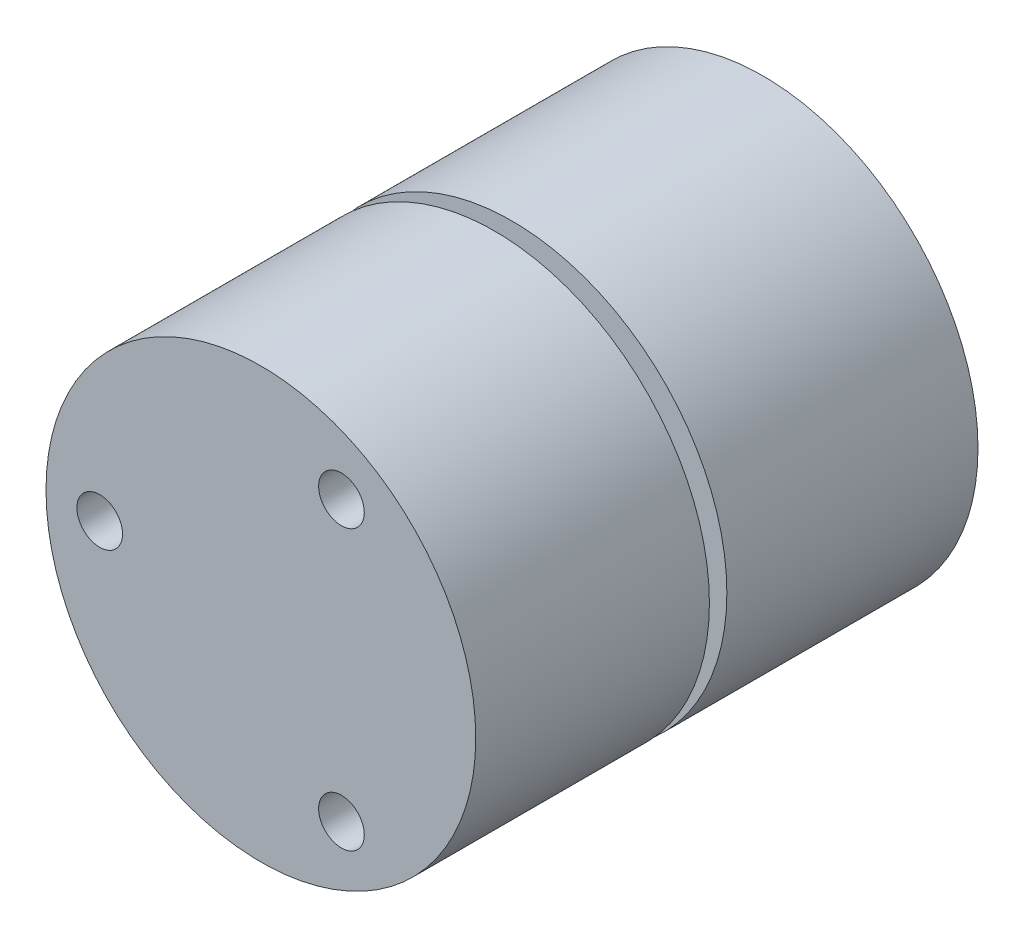
ISO-10303-21;
HEADER;
FILE_DESCRIPTION(('STEP AP214'),'2;1');
FILE_NAME('part.step','',(''),(''),'','','');
FILE_SCHEMA(('AUTOMOTIVE_DESIGN { 1 0 10303 214 1 1 1 1 }'));
ENDSEC;
DATA;
#1=APPLICATION_CONTEXT('core data for automotive mechanical design processes');
#2=APPLICATION_PROTOCOL_DEFINITION('international standard','automotive_design',2000,#1);
#3=PRODUCT_CONTEXT('',#1,'mechanical');
#4=PRODUCT('Part','Part','',(#3));
#5=PRODUCT_RELATED_PRODUCT_CATEGORY('part','',(#4));
#6=PRODUCT_DEFINITION_FORMATION('','',#4);
#7=PRODUCT_DEFINITION_CONTEXT('part definition',#1,'design');
#8=PRODUCT_DEFINITION('design','',#6,#7);
#9=PRODUCT_DEFINITION_SHAPE('','',#8);
#10=(LENGTH_UNIT() NAMED_UNIT(*) SI_UNIT(.MILLI.,.METRE.));
#11=(NAMED_UNIT(*) PLANE_ANGLE_UNIT() SI_UNIT($,.RADIAN.));
#12=(NAMED_UNIT(*) SI_UNIT($,.STERADIAN.) SOLID_ANGLE_UNIT());
#13=UNCERTAINTY_MEASURE_WITH_UNIT(LENGTH_MEASURE(1.E-05),#10,'distance_accuracy_value','');
#14=(GEOMETRIC_REPRESENTATION_CONTEXT(3) GLOBAL_UNCERTAINTY_ASSIGNED_CONTEXT((#13)) GLOBAL_UNIT_ASSIGNED_CONTEXT((#10,
#11,#12)) REPRESENTATION_CONTEXT('',''));
#15=CARTESIAN_POINT('',(0.,0.,0.));
#16=DIRECTION('',(0.,0.,1.));
#17=DIRECTION('',(1.,0.,0.));
#18=AXIS2_PLACEMENT_3D('',#15,#16,#17);
#19=CARTESIAN_POINT('',(0.,0.,18.7));
#20=DIRECTION('',(0.,0.,-1.));
#21=DIRECTION('',(-1.,0.,0.));
#22=AXIS2_PLACEMENT_3D('',#19,#20,#21);
#23=CYLINDRICAL_SURFACE('',#22,8.);
#24=CARTESIAN_POINT('',(0.,0.,11.9));
#25=DIRECTION('',(0.,0.,-1.));
#26=DIRECTION('',(-1.,0.,0.));
#27=AXIS2_PLACEMENT_3D('',#24,#25,#26);
#28=CIRCLE('',#27,8.);
#29=CARTESIAN_POINT('',(-7.41619848709566,-3.,11.9));
#30=VERTEX_POINT('',#29);
#31=CARTESIAN_POINT('',(-7.41619848709566,3.,11.9));
#32=VERTEX_POINT('',#31);
#33=EDGE_CURVE('E48',#30,#32,#28,.T.);
#34=ORIENTED_EDGE('',*,*,#33,.T.);
#35=DIRECTION('',(0.,0.,-1.));
#36=VECTOR('',#35,1.);
#37=CARTESIAN_POINT('',(-7.41619848709566,3.,18.7));
#38=LINE('',#37,#36);
#39=CARTESIAN_POINT('',(-7.41619848709566,3.,15.9));
#40=VERTEX_POINT('',#39);
#41=EDGE_CURVE('E11',#32,#40,#38,.F.);
#42=ORIENTED_EDGE('',*,*,#41,.T.);
#43=CARTESIAN_POINT('',(0.,0.,15.9));
#44=DIRECTION('',(0.,0.,1.));
#45=DIRECTION('',(1.,0.,0.));
#46=AXIS2_PLACEMENT_3D('',#43,#44,#45);
#47=CIRCLE('',#46,8.);
#48=CARTESIAN_POINT('',(-7.41619848709566,-3.,15.9));
#49=VERTEX_POINT('',#48);
#50=EDGE_CURVE('E82',#40,#49,#47,.T.);
#51=ORIENTED_EDGE('',*,*,#50,.T.);
#52=DIRECTION('',(0.,0.,-1.));
#53=VECTOR('',#52,1.);
#54=CARTESIAN_POINT('',(-7.41619848709566,-3.,18.7));
#55=LINE('',#54,#53);
#56=EDGE_CURVE('E130',#49,#30,#55,.T.);
#57=ORIENTED_EDGE('',*,*,#56,.T.);
#58=EDGE_LOOP('',(#34,#42,#51,#57));
#59=FACE_BOUND('',#58,.T.);
#60=CARTESIAN_POINT('',(0.,0.,18.7));
#61=DIRECTION('',(0.,0.,1.));
#62=DIRECTION('',(1.,0.,0.));
#63=AXIS2_PLACEMENT_3D('',#60,#61,#62);
#64=CIRCLE('',#63,8.);
#65=CARTESIAN_POINT('',(8.,0.,18.7));
#66=VERTEX_POINT('',#65);
#67=EDGE_CURVE('E121',#66,#66,#64,.T.);
#68=ORIENTED_EDGE('',*,*,#67,.F.);
#69=EDGE_LOOP('',(#68));
#70=FACE_BOUND('',#69,.T.);
#71=CARTESIAN_POINT('',(0.,0.,10.));
#72=DIRECTION('',(0.,0.,1.));
#73=DIRECTION('',(1.,0.,0.));
#74=AXIS2_PLACEMENT_3D('',#71,#72,#73);
#75=CIRCLE('',#74,8.);
#76=CARTESIAN_POINT('',(8.,0.,10.));
#77=VERTEX_POINT('',#76);
#78=EDGE_CURVE('E178',#77,#77,#75,.T.);
#79=ORIENTED_EDGE('',*,*,#78,.T.);
#80=EDGE_LOOP('',(#79));
#81=FACE_BOUND('',#80,.T.);
#82=ADVANCED_FACE('F39',(#59,#70,#81),#23,.T.);
#83=CARTESIAN_POINT('',(0.,0.,18.7));
#84=DIRECTION('',(0.,0.,1.));
#85=DIRECTION('',(1.,0.,0.));
#86=AXIS2_PLACEMENT_3D('',#83,#84,#85);
#87=PLANE('',#86);
#88=CARTESIAN_POINT('',(2.99999999999998,-5.19615242270664,18.7));
#89=DIRECTION('',(0.,0.,1.));
#90=DIRECTION('',(1.,0.,0.));
#91=AXIS2_PLACEMENT_3D('',#88,#89,#90);
#92=CIRCLE('',#91,0.85);
#93=CARTESIAN_POINT('',(3.84999999999998,-5.19615242270664,18.7));
#94=VERTEX_POINT('',#93);
#95=EDGE_CURVE('E227',#94,#94,#92,.T.);
#96=ORIENTED_EDGE('',*,*,#95,.F.);
#97=EDGE_LOOP('',(#96));
#98=FACE_BOUND('',#97,.T.);
#99=CARTESIAN_POINT('',(2.99999999999999,5.19615242270664,18.7));
#100=DIRECTION('',(0.,0.,1.));
#101=DIRECTION('',(1.,0.,0.));
#102=AXIS2_PLACEMENT_3D('',#99,#100,#101);
#103=CIRCLE('',#102,0.85);
#104=CARTESIAN_POINT('',(3.84999999999999,5.19615242270664,18.7));
#105=VERTEX_POINT('',#104);
#106=EDGE_CURVE('E212',#105,#105,#103,.T.);
#107=ORIENTED_EDGE('',*,*,#106,.F.);
#108=EDGE_LOOP('',(#107));
#109=FACE_BOUND('',#108,.T.);
#110=CARTESIAN_POINT('',(-6.,0.,18.7));
#111=DIRECTION('',(0.,0.,1.));
#112=DIRECTION('',(1.,0.,0.));
#113=AXIS2_PLACEMENT_3D('',#110,#111,#112);
#114=CIRCLE('',#113,0.85);
#115=CARTESIAN_POINT('',(-5.15,0.,18.7));
#116=VERTEX_POINT('',#115);
#117=EDGE_CURVE('E207',#116,#116,#114,.T.);
#118=ORIENTED_EDGE('',*,*,#117,.F.);
#119=EDGE_LOOP('',(#118));
#120=FACE_BOUND('',#119,.T.);
#121=ORIENTED_EDGE('',*,*,#67,.T.);
#122=EDGE_LOOP('',(#121));
#123=FACE_BOUND('',#122,.T.);
#124=ADVANCED_FACE('F151',(#98,#109,#120,#123),#87,.T.);
#125=CARTESIAN_POINT('',(-18.7,3.,11.9));
#126=DIRECTION('',(0.,1.,0.));
#127=DIRECTION('',(0.,0.,1.));
#128=AXIS2_PLACEMENT_3D('',#125,#126,#127);
#129=PLANE('',#128);
#130=DIRECTION('',(1.,0.,0.));
#131=VECTOR('',#130,1.);
#132=CARTESIAN_POINT('',(-18.7,3.,11.9));
#133=LINE('',#132,#131);
#134=CARTESIAN_POINT('',(0.,3.,11.9));
#135=VERTEX_POINT('',#134);
#136=EDGE_CURVE('E99',#32,#135,#133,.T.);
#137=ORIENTED_EDGE('',*,*,#136,.T.);
#138=DIRECTION('',(0.,0.,1.));
#139=VECTOR('',#138,1.);
#140=CARTESIAN_POINT('',(0.,3.,11.9));
#141=LINE('',#140,#139);
#142=CARTESIAN_POINT('',(0.,3.,15.9));
#143=VERTEX_POINT('',#142);
#144=EDGE_CURVE('E92',#135,#143,#141,.T.);
#145=ORIENTED_EDGE('',*,*,#144,.T.);
#146=DIRECTION('',(1.,0.,0.));
#147=VECTOR('',#146,1.);
#148=CARTESIAN_POINT('',(-18.7,3.,15.9));
#149=LINE('',#148,#147);
#150=EDGE_CURVE('E77',#40,#143,#149,.T.);
#151=ORIENTED_EDGE('',*,*,#150,.F.);
#152=ORIENTED_EDGE('',*,*,#41,.F.);
#153=EDGE_LOOP('',(#137,#145,#151,#152));
#154=FACE_BOUND('',#153,.T.);
#155=ADVANCED_FACE('F98',(#154),#129,.F.);
#156=CARTESIAN_POINT('',(-18.7,-3.,11.9));
#157=DIRECTION('',(0.,0.,-1.));
#158=DIRECTION('',(-1.,0.,0.));
#159=AXIS2_PLACEMENT_3D('',#156,#157,#158);
#160=PLANE('',#159);
#161=DIRECTION('',(1.,0.,0.));
#162=VECTOR('',#161,1.);
#163=CARTESIAN_POINT('',(-18.7,-3.,11.9));
#164=LINE('',#163,#162);
#165=CARTESIAN_POINT('',(0.,-3.,11.9));
#166=VERTEX_POINT('',#165);
#167=EDGE_CURVE('E116',#30,#166,#164,.T.);
#168=ORIENTED_EDGE('',*,*,#167,.T.);
#169=DIRECTION('',(0.,1.,0.));
#170=VECTOR('',#169,1.);
#171=CARTESIAN_POINT('',(0.,-3.,11.9));
#172=LINE('',#171,#170);
#173=EDGE_CURVE('E85',#166,#135,#172,.T.);
#174=ORIENTED_EDGE('',*,*,#173,.T.);
#175=ORIENTED_EDGE('',*,*,#136,.F.);
#176=ORIENTED_EDGE('',*,*,#33,.F.);
#177=EDGE_LOOP('',(#168,#174,#175,#176));
#178=FACE_BOUND('',#177,.T.);
#179=ADVANCED_FACE('F139',(#178),#160,.F.);
#180=CARTESIAN_POINT('',(-18.7,-3.,15.9));
#181=DIRECTION('',(0.,-1.,0.));
#182=DIRECTION('',(0.,0.,-1.));
#183=AXIS2_PLACEMENT_3D('',#180,#181,#182);
#184=PLANE('',#183);
#185=DIRECTION('',(1.,0.,0.));
#186=VECTOR('',#185,1.);
#187=CARTESIAN_POINT('',(-18.7,-3.,15.9));
#188=LINE('',#187,#186);
#189=CARTESIAN_POINT('',(0.,-3.,15.9));
#190=VERTEX_POINT('',#189);
#191=EDGE_CURVE('E55',#49,#190,#188,.T.);
#192=ORIENTED_EDGE('',*,*,#191,.T.);
#193=DIRECTION('',(0.,0.,-1.));
#194=VECTOR('',#193,1.);
#195=CARTESIAN_POINT('',(0.,-3.,15.9));
#196=LINE('',#195,#194);
#197=EDGE_CURVE('E95',#190,#166,#196,.T.);
#198=ORIENTED_EDGE('',*,*,#197,.T.);
#199=ORIENTED_EDGE('',*,*,#167,.F.);
#200=ORIENTED_EDGE('',*,*,#56,.F.);
#201=EDGE_LOOP('',(#192,#198,#199,#200));
#202=FACE_BOUND('',#201,.T.);
#203=ADVANCED_FACE('F141',(#202),#184,.F.);
#204=CARTESIAN_POINT('',(-18.7,3.,15.9));
#205=DIRECTION('',(0.,0.,1.));
#206=DIRECTION('',(1.,0.,0.));
#207=AXIS2_PLACEMENT_3D('',#204,#205,#206);
#208=PLANE('',#207);
#209=ORIENTED_EDGE('',*,*,#150,.T.);
#210=DIRECTION('',(0.,-1.,0.));
#211=VECTOR('',#210,1.);
#212=CARTESIAN_POINT('',(0.,3.,15.9));
#213=LINE('',#212,#211);
#214=EDGE_CURVE('E80',#143,#190,#213,.T.);
#215=ORIENTED_EDGE('',*,*,#214,.T.);
#216=ORIENTED_EDGE('',*,*,#191,.F.);
#217=ORIENTED_EDGE('',*,*,#50,.F.);
#218=EDGE_LOOP('',(#209,#215,#216,#217));
#219=FACE_BOUND('',#218,.T.);
#220=ADVANCED_FACE('F79',(#219),#208,.F.);
#221=CARTESIAN_POINT('',(0.,0.,0.));
#222=DIRECTION('',(1.,0.,0.));
#223=DIRECTION('',(0.,0.,-1.));
#224=AXIS2_PLACEMENT_3D('',#221,#222,#223);
#225=PLANE('',#224);
#226=ORIENTED_EDGE('',*,*,#144,.F.);
#227=ORIENTED_EDGE('',*,*,#173,.F.);
#228=ORIENTED_EDGE('',*,*,#197,.F.);
#229=ORIENTED_EDGE('',*,*,#214,.F.);
#230=EDGE_LOOP('',(#226,#227,#228,#229));
#231=FACE_BOUND('',#230,.T.);
#232=ADVANCED_FACE('F90',(#231),#225,.F.);
#233=CARTESIAN_POINT('',(0.,8.,10.));
#234=DIRECTION('',(0.,0.,-1.));
#235=DIRECTION('',(-1.,0.,0.));
#236=AXIS2_PLACEMENT_3D('',#233,#234,#235);
#237=PLANE('',#236);
#238=CARTESIAN_POINT('',(0.,0.,10.));
#239=DIRECTION('',(0.,0.,1.));
#240=DIRECTION('',(1.,0.,0.));
#241=AXIS2_PLACEMENT_3D('',#238,#239,#240);
#242=CIRCLE('',#241,4.71457689328128);
#243=CARTESIAN_POINT('',(4.71457689328128,0.,10.));
#244=VERTEX_POINT('',#243);
#245=EDGE_CURVE('E101',#244,#244,#242,.T.);
#246=ORIENTED_EDGE('',*,*,#245,.T.);
#247=EDGE_LOOP('',(#246));
#248=FACE_BOUND('',#247,.T.);
#249=ORIENTED_EDGE('',*,*,#78,.F.);
#250=EDGE_LOOP('',(#249));
#251=FACE_BOUND('',#250,.T.);
#252=ADVANCED_FACE('F252',(#248,#251),#237,.T.);
#253=CARTESIAN_POINT('',(0.,0.,18.7));
#254=DIRECTION('',(0.,0.,1.));
#255=DIRECTION('',(1.,0.,0.));
#256=AXIS2_PLACEMENT_3D('',#253,#254,#255);
#257=CYLINDRICAL_SURFACE('',#256,4.71457689328128);
#258=ORIENTED_EDGE('',*,*,#245,.F.);
#259=EDGE_LOOP('',(#258));
#260=FACE_BOUND('',#259,.T.);
#261=CARTESIAN_POINT('',(0.,0.,9.35));
#262=DIRECTION('',(0.,0.,1.));
#263=DIRECTION('',(1.,0.,0.));
#264=AXIS2_PLACEMENT_3D('',#261,#262,#263);
#265=CIRCLE('',#264,4.71457689328128);
#266=CARTESIAN_POINT('',(4.71457689328128,0.,9.35));
#267=VERTEX_POINT('',#266);
#268=EDGE_CURVE('E105',#267,#267,#265,.T.);
#269=ORIENTED_EDGE('',*,*,#268,.T.);
#270=EDGE_LOOP('',(#269));
#271=FACE_BOUND('',#270,.T.);
#272=ADVANCED_FACE('F254',(#260,#271),#257,.T.);
#273=CARTESIAN_POINT('',(0.,8.,9.35));
#274=DIRECTION('',(0.,0.,-1.));
#275=DIRECTION('',(-1.,0.,0.));
#276=AXIS2_PLACEMENT_3D('',#273,#274,#275);
#277=PLANE('',#276);
#278=ORIENTED_EDGE('',*,*,#268,.F.);
#279=EDGE_LOOP('',(#278));
#280=FACE_BOUND('',#279,.T.);
#281=CARTESIAN_POINT('',(0.,0.,9.35));
#282=DIRECTION('',(0.,0.,1.));
#283=DIRECTION('',(1.,0.,0.));
#284=AXIS2_PLACEMENT_3D('',#281,#282,#283);
#285=CIRCLE('',#284,8.);
#286=CARTESIAN_POINT('',(8.,0.,9.35));
#287=VERTEX_POINT('',#286);
#288=EDGE_CURVE('E173',#287,#287,#285,.T.);
#289=ORIENTED_EDGE('',*,*,#288,.T.);
#290=EDGE_LOOP('',(#289));
#291=FACE_BOUND('',#290,.T.);
#292=ADVANCED_FACE('F168',(#280,#291),#277,.F.);
#293=CARTESIAN_POINT('',(0.,0.,0.));
#294=DIRECTION('',(0.,0.,1.));
#295=DIRECTION('',(1.,0.,0.));
#296=AXIS2_PLACEMENT_3D('',#293,#294,#295);
#297=PLANE('',#296);
#298=CARTESIAN_POINT('',(2.99999999999998,-5.19615242270664,0.));
#299=DIRECTION('',(0.,0.,-1.));
#300=DIRECTION('',(-1.,0.,0.));
#301=AXIS2_PLACEMENT_3D('',#298,#299,#300);
#302=CIRCLE('',#301,0.85);
#303=CARTESIAN_POINT('',(2.14999999999998,-5.19615242270664,0.));
#304=VERTEX_POINT('',#303);
#305=EDGE_CURVE('E219',#304,#304,#302,.T.);
#306=ORIENTED_EDGE('',*,*,#305,.F.);
#307=EDGE_LOOP('',(#306));
#308=FACE_BOUND('',#307,.T.);
#309=CARTESIAN_POINT('',(-6.,0.,0.));
#310=DIRECTION('',(0.,0.,1.));
#311=DIRECTION('',(1.,0.,0.));
#312=AXIS2_PLACEMENT_3D('',#309,#310,#311);
#313=CIRCLE('',#312,0.85);
#314=CARTESIAN_POINT('',(-5.15,0.,0.));
#315=VERTEX_POINT('',#314);
#316=EDGE_CURVE('E196',#315,#315,#313,.T.);
#317=ORIENTED_EDGE('',*,*,#316,.T.);
#318=EDGE_LOOP('',(#317));
#319=FACE_BOUND('',#318,.T.);
#320=CARTESIAN_POINT('',(2.99999999999999,5.19615242270664,0.));
#321=DIRECTION('',(0.,0.,1.));
#322=DIRECTION('',(1.,0.,0.));
#323=AXIS2_PLACEMENT_3D('',#320,#321,#322);
#324=CIRCLE('',#323,0.85);
#325=CARTESIAN_POINT('',(3.84999999999999,5.19615242270664,0.));
#326=VERTEX_POINT('',#325);
#327=EDGE_CURVE('E191',#326,#326,#324,.T.);
#328=ORIENTED_EDGE('',*,*,#327,.T.);
#329=EDGE_LOOP('',(#328));
#330=FACE_BOUND('',#329,.T.);
#331=CARTESIAN_POINT('',(0.,0.,0.));
#332=DIRECTION('',(0.,0.,1.));
#333=DIRECTION('',(1.,0.,0.));
#334=AXIS2_PLACEMENT_3D('',#331,#332,#333);
#335=CIRCLE('',#334,8.);
#336=CARTESIAN_POINT('',(8.,0.,0.));
#337=VERTEX_POINT('',#336);
#338=EDGE_CURVE('E115',#337,#337,#335,.T.);
#339=ORIENTED_EDGE('',*,*,#338,.F.);
#340=EDGE_LOOP('',(#339));
#341=FACE_BOUND('',#340,.T.);
#342=ADVANCED_FACE('F159',(#308,#319,#330,#341),#297,.F.);
#343=ORIENTED_EDGE('',*,*,#288,.F.);
#344=EDGE_LOOP('',(#343));
#345=FACE_BOUND('',#344,.T.);
#346=ORIENTED_EDGE('',*,*,#338,.T.);
#347=EDGE_LOOP('',(#346));
#348=FACE_BOUND('',#347,.T.);
#349=ADVANCED_FACE('F41',(#345,#348),#23,.T.);
#350=CARTESIAN_POINT('',(2.99999999999999,5.19615242270664,2.));
#351=DIRECTION('',(0.,0.,-1.));
#352=DIRECTION('',(-1.,0.,0.));
#353=AXIS2_PLACEMENT_3D('',#350,#351,#352);
#354=CYLINDRICAL_SURFACE('',#353,0.85);
#355=CARTESIAN_POINT('',(2.99999999999999,5.19615242270664,2.));
#356=DIRECTION('',(0.,0.,1.));
#357=DIRECTION('',(1.,0.,0.));
#358=AXIS2_PLACEMENT_3D('',#355,#356,#357);
#359=CIRCLE('',#358,0.85);
#360=CARTESIAN_POINT('',(3.84999999999999,5.19615242270664,2.));
#361=VERTEX_POINT('',#360);
#362=EDGE_CURVE('E187',#361,#361,#359,.T.);
#363=ORIENTED_EDGE('',*,*,#362,.T.);
#364=EDGE_LOOP('',(#363));
#365=FACE_BOUND('',#364,.T.);
#366=ORIENTED_EDGE('',*,*,#327,.F.);
#367=EDGE_LOOP('',(#366));
#368=FACE_BOUND('',#367,.T.);
#369=ADVANCED_FACE('F158',(#365,#368),#354,.F.);
#370=CARTESIAN_POINT('',(2.99999999999999,5.19615242270664,2.));
#371=DIRECTION('',(0.,0.,1.));
#372=DIRECTION('',(1.,0.,0.));
#373=AXIS2_PLACEMENT_3D('',#370,#371,#372);
#374=PLANE('',#373);
#375=ORIENTED_EDGE('',*,*,#362,.F.);
#376=EDGE_LOOP('',(#375));
#377=FACE_BOUND('',#376,.T.);
#378=ADVANCED_FACE('F165',(#377),#374,.F.);
#379=CARTESIAN_POINT('',(-6.,0.,2.));
#380=DIRECTION('',(0.,0.,-1.));
#381=DIRECTION('',(-1.,0.,0.));
#382=AXIS2_PLACEMENT_3D('',#379,#380,#381);
#383=CYLINDRICAL_SURFACE('',#382,0.85);
#384=CARTESIAN_POINT('',(-6.,0.,2.));
#385=DIRECTION('',(0.,0.,1.));
#386=DIRECTION('',(1.,0.,0.));
#387=AXIS2_PLACEMENT_3D('',#384,#385,#386);
#388=CIRCLE('',#387,0.85);
#389=CARTESIAN_POINT('',(-5.15,0.,2.));
#390=VERTEX_POINT('',#389);
#391=EDGE_CURVE('E184',#390,#390,#388,.T.);
#392=ORIENTED_EDGE('',*,*,#391,.T.);
#393=EDGE_LOOP('',(#392));
#394=FACE_BOUND('',#393,.T.);
#395=ORIENTED_EDGE('',*,*,#316,.F.);
#396=EDGE_LOOP('',(#395));
#397=FACE_BOUND('',#396,.T.);
#398=ADVANCED_FACE('F269',(#394,#397),#383,.F.);
#399=CARTESIAN_POINT('',(-6.,0.,2.));
#400=DIRECTION('',(0.,0.,1.));
#401=DIRECTION('',(1.,0.,0.));
#402=AXIS2_PLACEMENT_3D('',#399,#400,#401);
#403=PLANE('',#402);
#404=ORIENTED_EDGE('',*,*,#391,.F.);
#405=EDGE_LOOP('',(#404));
#406=FACE_BOUND('',#405,.T.);
#407=ADVANCED_FACE('F274',(#406),#403,.F.);
#408=CARTESIAN_POINT('',(-6.,0.,16.7));
#409=DIRECTION('',(0.,0.,1.));
#410=DIRECTION('',(1.,0.,0.));
#411=AXIS2_PLACEMENT_3D('',#408,#409,#410);
#412=CYLINDRICAL_SURFACE('',#411,0.85);
#413=CARTESIAN_POINT('',(-6.,0.,16.7));
#414=DIRECTION('',(0.,0.,1.));
#415=DIRECTION('',(1.,0.,0.));
#416=AXIS2_PLACEMENT_3D('',#413,#414,#415);
#417=CIRCLE('',#416,0.85);
#418=CARTESIAN_POINT('',(-5.15,0.,16.7));
#419=VERTEX_POINT('',#418);
#420=EDGE_CURVE('E203',#419,#419,#417,.T.);
#421=ORIENTED_EDGE('',*,*,#420,.F.);
#422=EDGE_LOOP('',(#421));
#423=FACE_BOUND('',#422,.T.);
#424=ORIENTED_EDGE('',*,*,#117,.T.);
#425=EDGE_LOOP('',(#424));
#426=FACE_BOUND('',#425,.T.);
#427=ADVANCED_FACE('F278',(#423,#426),#412,.F.);
#428=CARTESIAN_POINT('',(-6.,0.,16.7));
#429=DIRECTION('',(0.,0.,1.));
#430=DIRECTION('',(1.,0.,0.));
#431=AXIS2_PLACEMENT_3D('',#428,#429,#430);
#432=PLANE('',#431);
#433=ORIENTED_EDGE('',*,*,#420,.T.);
#434=EDGE_LOOP('',(#433));
#435=FACE_BOUND('',#434,.T.);
#436=ADVANCED_FACE('F280',(#435),#432,.T.);
#437=CARTESIAN_POINT('',(2.99999999999999,5.19615242270664,16.7));
#438=DIRECTION('',(0.,0.,1.));
#439=DIRECTION('',(1.,0.,0.));
#440=AXIS2_PLACEMENT_3D('',#437,#438,#439);
#441=CYLINDRICAL_SURFACE('',#440,0.85);
#442=CARTESIAN_POINT('',(2.99999999999999,5.19615242270664,16.7));
#443=DIRECTION('',(0.,0.,1.));
#444=DIRECTION('',(1.,0.,0.));
#445=AXIS2_PLACEMENT_3D('',#442,#443,#444);
#446=CIRCLE('',#445,0.85);
#447=CARTESIAN_POINT('',(3.84999999999999,5.19615242270664,16.7));
#448=VERTEX_POINT('',#447);
#449=EDGE_CURVE('E192',#448,#448,#446,.T.);
#450=ORIENTED_EDGE('',*,*,#449,.F.);
#451=EDGE_LOOP('',(#450));
#452=FACE_BOUND('',#451,.T.);
#453=ORIENTED_EDGE('',*,*,#106,.T.);
#454=EDGE_LOOP('',(#453));
#455=FACE_BOUND('',#454,.T.);
#456=ADVANCED_FACE('F283',(#452,#455),#441,.F.);
#457=CARTESIAN_POINT('',(2.99999999999999,5.19615242270664,16.7));
#458=DIRECTION('',(0.,0.,1.));
#459=DIRECTION('',(1.,0.,0.));
#460=AXIS2_PLACEMENT_3D('',#457,#458,#459);
#461=PLANE('',#460);
#462=ORIENTED_EDGE('',*,*,#449,.T.);
#463=EDGE_LOOP('',(#462));
#464=FACE_BOUND('',#463,.T.);
#465=ADVANCED_FACE('F290',(#464),#461,.T.);
#466=CARTESIAN_POINT('',(2.99999999999998,-5.19615242270664,2.));
#467=DIRECTION('',(0.,0.,-1.));
#468=DIRECTION('',(-1.,0.,0.));
#469=AXIS2_PLACEMENT_3D('',#466,#467,#468);
#470=CYLINDRICAL_SURFACE('',#469,0.85);
#471=CARTESIAN_POINT('',(2.99999999999998,-5.19615242270664,2.));
#472=DIRECTION('',(0.,0.,-1.));
#473=DIRECTION('',(-1.,0.,0.));
#474=AXIS2_PLACEMENT_3D('',#471,#472,#473);
#475=CIRCLE('',#474,0.85);
#476=CARTESIAN_POINT('',(2.14999999999998,-5.19615242270664,2.));
#477=VERTEX_POINT('',#476);
#478=EDGE_CURVE('E208',#477,#477,#475,.T.);
#479=ORIENTED_EDGE('',*,*,#478,.F.);
#480=EDGE_LOOP('',(#479));
#481=FACE_BOUND('',#480,.T.);
#482=ORIENTED_EDGE('',*,*,#305,.T.);
#483=EDGE_LOOP('',(#482));
#484=FACE_BOUND('',#483,.T.);
#485=ADVANCED_FACE('F294',(#481,#484),#470,.F.);
#486=CARTESIAN_POINT('',(2.99999999999998,-5.19615242270664,2.));
#487=DIRECTION('',(0.,0.,-1.));
#488=DIRECTION('',(-1.,0.,0.));
#489=AXIS2_PLACEMENT_3D('',#486,#487,#488);
#490=PLANE('',#489);
#491=ORIENTED_EDGE('',*,*,#478,.T.);
#492=EDGE_LOOP('',(#491));
#493=FACE_BOUND('',#492,.T.);
#494=ADVANCED_FACE('F240',(#493),#490,.T.);
#495=CARTESIAN_POINT('',(2.99999999999998,-5.19615242270664,16.7));
#496=DIRECTION('',(0.,0.,1.));
#497=DIRECTION('',(1.,0.,0.));
#498=AXIS2_PLACEMENT_3D('',#495,#496,#497);
#499=CYLINDRICAL_SURFACE('',#498,0.85);
#500=CARTESIAN_POINT('',(2.99999999999998,-5.19615242270664,16.7));
#501=DIRECTION('',(0.,0.,1.));
#502=DIRECTION('',(1.,0.,0.));
#503=AXIS2_PLACEMENT_3D('',#500,#501,#502);
#504=CIRCLE('',#503,0.85);
#505=CARTESIAN_POINT('',(3.84999999999998,-5.19615242270664,16.7));
#506=VERTEX_POINT('',#505);
#507=EDGE_CURVE('E223',#506,#506,#504,.T.);
#508=ORIENTED_EDGE('',*,*,#507,.F.);
#509=EDGE_LOOP('',(#508));
#510=FACE_BOUND('',#509,.T.);
#511=ORIENTED_EDGE('',*,*,#95,.T.);
#512=EDGE_LOOP('',(#511));
#513=FACE_BOUND('',#512,.T.);
#514=ADVANCED_FACE('F237',(#510,#513),#499,.F.);
#515=CARTESIAN_POINT('',(2.99999999999998,-5.19615242270664,16.7));
#516=DIRECTION('',(0.,0.,1.));
#517=DIRECTION('',(1.,0.,0.));
#518=AXIS2_PLACEMENT_3D('',#515,#516,#517);
#519=PLANE('',#518);
#520=ORIENTED_EDGE('',*,*,#507,.T.);
#521=EDGE_LOOP('',(#520));
#522=FACE_BOUND('',#521,.T.);
#523=ADVANCED_FACE('F235',(#522),#519,.T.);
#524=CLOSED_SHELL('',(#82,#124,#155,#179,#203,#220,#232,#252,#272,#292,#342,#349,#369,#378,#398,
#407,#427,#436,#456,#465,#485,#494,#514,#523));
#525=MANIFOLD_SOLID_BREP('B2',#524);
#526=ADVANCED_BREP_SHAPE_REPRESENTATION('',(#18,#525),#14);
#527=SHAPE_DEFINITION_REPRESENTATION(#9,#526);
ENDSEC;
END-ISO-10303-21;
